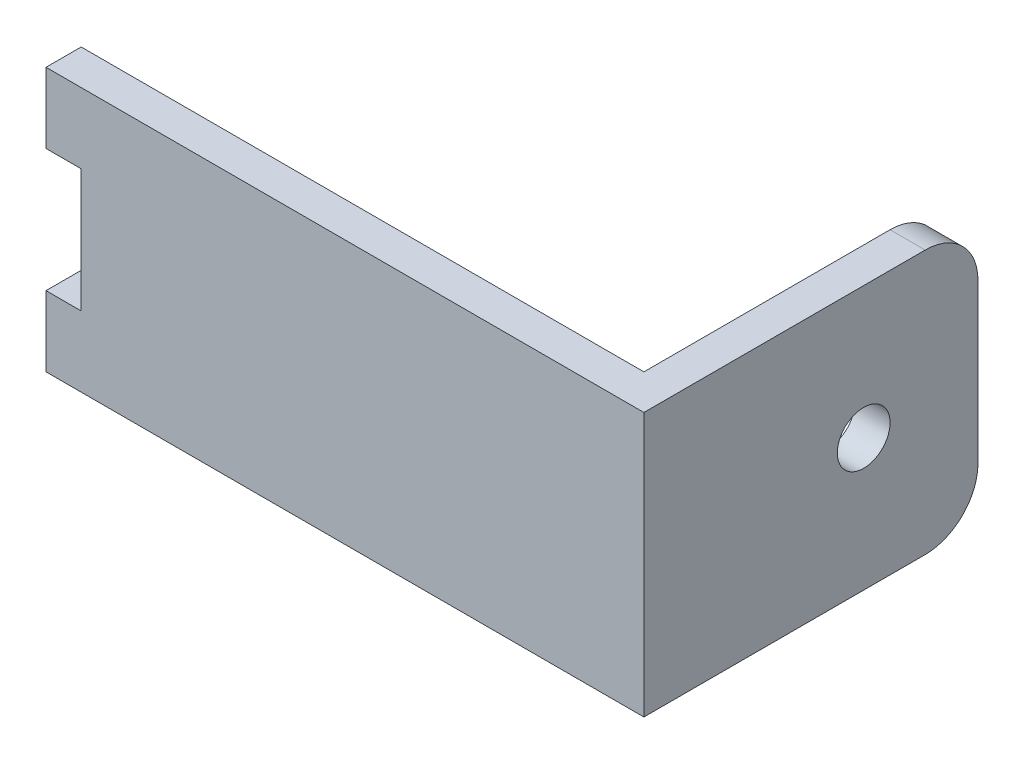
ISO-10303-21;
HEADER;
FILE_DESCRIPTION(('STEP AP214'),'2;1');
FILE_NAME('part.step','',(''),(''),'','','');
FILE_SCHEMA(('AUTOMOTIVE_DESIGN { 1 0 10303 214 1 1 1 1 }'));
ENDSEC;
DATA;
#1=APPLICATION_CONTEXT('core data for automotive mechanical design processes');
#2=APPLICATION_PROTOCOL_DEFINITION('international standard','automotive_design',2000,#1);
#3=PRODUCT_CONTEXT('',#1,'mechanical');
#4=PRODUCT('Part','Part','',(#3));
#5=PRODUCT_RELATED_PRODUCT_CATEGORY('part','',(#4));
#6=PRODUCT_DEFINITION_FORMATION('','',#4);
#7=PRODUCT_DEFINITION_CONTEXT('part definition',#1,'design');
#8=PRODUCT_DEFINITION('design','',#6,#7);
#9=PRODUCT_DEFINITION_SHAPE('','',#8);
#10=(LENGTH_UNIT() NAMED_UNIT(*) SI_UNIT(.MILLI.,.METRE.));
#11=(NAMED_UNIT(*) PLANE_ANGLE_UNIT() SI_UNIT($,.RADIAN.));
#12=(NAMED_UNIT(*) SI_UNIT($,.STERADIAN.) SOLID_ANGLE_UNIT());
#13=UNCERTAINTY_MEASURE_WITH_UNIT(LENGTH_MEASURE(1.E-05),#10,'distance_accuracy_value','');
#14=(GEOMETRIC_REPRESENTATION_CONTEXT(3) GLOBAL_UNCERTAINTY_ASSIGNED_CONTEXT((#13)) GLOBAL_UNIT_ASSIGNED_CONTEXT((#10,
#11,#12)) REPRESENTATION_CONTEXT('',''));
#15=CARTESIAN_POINT('',(0.,0.,0.));
#16=DIRECTION('',(0.,0.,1.));
#17=DIRECTION('',(1.,0.,0.));
#18=AXIS2_PLACEMENT_3D('',#15,#16,#17);
#19=CARTESIAN_POINT('',(0.,0.,2.));
#20=DIRECTION('',(1.,0.,0.));
#21=DIRECTION('',(0.,0.,-1.));
#22=AXIS2_PLACEMENT_3D('',#19,#20,#21);
#23=PLANE('',#22);
#24=DIRECTION('',(0.,0.,-1.));
#25=VECTOR('',#24,1.);
#26=CARTESIAN_POINT('',(0.,4.,2.));
#27=LINE('',#26,#25);
#28=CARTESIAN_POINT('',(0.,4.,2.));
#29=VERTEX_POINT('',#28);
#30=CARTESIAN_POINT('',(0.,4.,0.));
#31=VERTEX_POINT('',#30);
#32=EDGE_CURVE('E49',#29,#31,#27,.T.);
#33=ORIENTED_EDGE('',*,*,#32,.F.);
#34=DIRECTION('',(0.,-1.,0.));
#35=VECTOR('',#34,1.);
#36=CARTESIAN_POINT('',(0.,0.,2.));
#37=LINE('',#36,#35);
#38=CARTESIAN_POINT('',(0.,11.,2.));
#39=VERTEX_POINT('',#38);
#40=EDGE_CURVE('E143',#39,#29,#37,.T.);
#41=ORIENTED_EDGE('',*,*,#40,.F.);
#42=DIRECTION('',(0.,0.,1.));
#43=VECTOR('',#42,1.);
#44=CARTESIAN_POINT('',(0.,11.,0.));
#45=LINE('',#44,#43);
#46=CARTESIAN_POINT('',(0.,11.,0.));
#47=VERTEX_POINT('',#46);
#48=EDGE_CURVE('E144',#47,#39,#45,.T.);
#49=ORIENTED_EDGE('',*,*,#48,.F.);
#50=DIRECTION('',(0.,-1.,0.));
#51=VECTOR('',#50,1.);
#52=CARTESIAN_POINT('',(0.,0.,0.));
#53=LINE('',#52,#51);
#54=EDGE_CURVE('E54',#47,#31,#53,.T.);
#55=ORIENTED_EDGE('',*,*,#54,.T.);
#56=EDGE_LOOP('',(#33,#41,#49,#55));
#57=FACE_BOUND('',#56,.T.);
#58=ADVANCED_FACE('F34',(#57),#23,.F.);
#59=CARTESIAN_POINT('',(0.,0.,2.));
#60=DIRECTION('',(0.,1.,0.));
#61=DIRECTION('',(0.,0.,1.));
#62=AXIS2_PLACEMENT_3D('',#59,#60,#61);
#63=PLANE('',#62);
#64=DIRECTION('',(0.,0.,-1.));
#65=VECTOR('',#64,1.);
#66=CARTESIAN_POINT('',(30.,0.,2.));
#67=LINE('',#66,#65);
#68=CARTESIAN_POINT('',(30.,0.,0.));
#69=VERTEX_POINT('',#68);
#70=CARTESIAN_POINT('',(30.,0.,-14.));
#71=VERTEX_POINT('',#70);
#72=EDGE_CURVE('E171',#69,#71,#67,.T.);
#73=ORIENTED_EDGE('',*,*,#72,.T.);
#74=DIRECTION('',(-1.,0.,0.));
#75=VECTOR('',#74,1.);
#76=CARTESIAN_POINT('',(0.,0.,-14.));
#77=LINE('',#76,#75);
#78=CARTESIAN_POINT('',(32.,0.,-14.));
#79=VERTEX_POINT('',#78);
#80=EDGE_CURVE('E214',#71,#79,#77,.F.);
#81=ORIENTED_EDGE('',*,*,#80,.T.);
#82=DIRECTION('',(0.,0.,-1.));
#83=VECTOR('',#82,1.);
#84=CARTESIAN_POINT('',(32.,0.,2.));
#85=LINE('',#84,#83);
#86=CARTESIAN_POINT('',(32.,0.,2.));
#87=VERTEX_POINT('',#86);
#88=EDGE_CURVE('E177',#87,#79,#85,.T.);
#89=ORIENTED_EDGE('',*,*,#88,.F.);
#90=DIRECTION('',(1.,0.,0.));
#91=VECTOR('',#90,1.);
#92=CARTESIAN_POINT('',(0.,0.,2.));
#93=LINE('',#92,#91);
#94=CARTESIAN_POINT('',(-2.,0.,2.));
#95=VERTEX_POINT('',#94);
#96=EDGE_CURVE('E193',#95,#87,#93,.T.);
#97=ORIENTED_EDGE('',*,*,#96,.F.);
#98=DIRECTION('',(0.,0.,1.));
#99=VECTOR('',#98,1.);
#100=CARTESIAN_POINT('',(-2.,0.,2.));
#101=LINE('',#100,#99);
#102=CARTESIAN_POINT('',(-2.,0.,0.));
#103=VERTEX_POINT('',#102);
#104=EDGE_CURVE('E138',#103,#95,#101,.T.);
#105=ORIENTED_EDGE('',*,*,#104,.F.);
#106=DIRECTION('',(1.,0.,0.));
#107=VECTOR('',#106,1.);
#108=CARTESIAN_POINT('',(0.,0.,0.));
#109=LINE('',#108,#107);
#110=EDGE_CURVE('E200',#103,#69,#109,.T.);
#111=ORIENTED_EDGE('',*,*,#110,.T.);
#112=EDGE_LOOP('',(#73,#81,#89,#97,#105,#111));
#113=FACE_BOUND('',#112,.T.);
#114=ADVANCED_FACE('F235',(#113),#63,.F.);
#115=CARTESIAN_POINT('',(0.,15.,2.));
#116=DIRECTION('',(0.,-1.,0.));
#117=DIRECTION('',(0.,0.,-1.));
#118=AXIS2_PLACEMENT_3D('',#115,#116,#117);
#119=PLANE('',#118);
#120=DIRECTION('',(0.,0.,1.));
#121=VECTOR('',#120,1.);
#122=CARTESIAN_POINT('',(32.,15.,2.));
#123=LINE('',#122,#121);
#124=CARTESIAN_POINT('',(32.,15.,-14.));
#125=VERTEX_POINT('',#124);
#126=CARTESIAN_POINT('',(32.,15.,2.));
#127=VERTEX_POINT('',#126);
#128=EDGE_CURVE('E184',#125,#127,#123,.T.);
#129=ORIENTED_EDGE('',*,*,#128,.F.);
#130=DIRECTION('',(-1.,0.,0.));
#131=VECTOR('',#130,1.);
#132=CARTESIAN_POINT('',(0.,15.,-14.));
#133=LINE('',#132,#131);
#134=CARTESIAN_POINT('',(30.,15.,-14.));
#135=VERTEX_POINT('',#134);
#136=EDGE_CURVE('E11',#125,#135,#133,.T.);
#137=ORIENTED_EDGE('',*,*,#136,.T.);
#138=DIRECTION('',(0.,0.,1.));
#139=VECTOR('',#138,1.);
#140=CARTESIAN_POINT('',(30.,15.,2.));
#141=LINE('',#140,#139);
#142=CARTESIAN_POINT('',(30.,15.,0.));
#143=VERTEX_POINT('',#142);
#144=EDGE_CURVE('E178',#135,#143,#141,.T.);
#145=ORIENTED_EDGE('',*,*,#144,.T.);
#146=DIRECTION('',(-1.,0.,0.));
#147=VECTOR('',#146,1.);
#148=CARTESIAN_POINT('',(0.,15.,0.));
#149=LINE('',#148,#147);
#150=CARTESIAN_POINT('',(-2.,15.,0.));
#151=VERTEX_POINT('',#150);
#152=EDGE_CURVE('E194',#143,#151,#149,.T.);
#153=ORIENTED_EDGE('',*,*,#152,.T.);
#154=DIRECTION('',(0.,0.,-1.));
#155=VECTOR('',#154,1.);
#156=CARTESIAN_POINT('',(-2.,15.,0.));
#157=LINE('',#156,#155);
#158=CARTESIAN_POINT('',(-2.,15.,2.));
#159=VERTEX_POINT('',#158);
#160=EDGE_CURVE('E159',#159,#151,#157,.T.);
#161=ORIENTED_EDGE('',*,*,#160,.F.);
#162=DIRECTION('',(-1.,0.,0.));
#163=VECTOR('',#162,1.);
#164=CARTESIAN_POINT('',(0.,15.,2.));
#165=LINE('',#164,#163);
#166=EDGE_CURVE('E196',#127,#159,#165,.T.);
#167=ORIENTED_EDGE('',*,*,#166,.F.);
#168=EDGE_LOOP('',(#129,#137,#145,#153,#161,#167));
#169=FACE_BOUND('',#168,.T.);
#170=ADVANCED_FACE('F244',(#169),#119,.F.);
#171=CARTESIAN_POINT('',(0.,0.,2.));
#172=DIRECTION('',(0.,0.,-1.));
#173=DIRECTION('',(-1.,0.,0.));
#174=AXIS2_PLACEMENT_3D('',#171,#172,#173);
#175=PLANE('',#174);
#176=ORIENTED_EDGE('',*,*,#166,.T.);
#177=DIRECTION('',(0.,1.,0.));
#178=VECTOR('',#177,1.);
#179=CARTESIAN_POINT('',(-2.,15.,2.));
#180=LINE('',#179,#178);
#181=CARTESIAN_POINT('',(-2.,11.,2.));
#182=VERTEX_POINT('',#181);
#183=EDGE_CURVE('E156',#182,#159,#180,.T.);
#184=ORIENTED_EDGE('',*,*,#183,.F.);
#185=DIRECTION('',(1.,0.,0.));
#186=VECTOR('',#185,1.);
#187=CARTESIAN_POINT('',(-2.,11.,2.));
#188=LINE('',#187,#186);
#189=EDGE_CURVE('E161',#182,#39,#188,.T.);
#190=ORIENTED_EDGE('',*,*,#189,.T.);
#191=ORIENTED_EDGE('',*,*,#40,.T.);
#192=DIRECTION('',(1.,0.,0.));
#193=VECTOR('',#192,1.);
#194=CARTESIAN_POINT('',(-2.,4.,2.));
#195=LINE('',#194,#193);
#196=CARTESIAN_POINT('',(-2.,4.,2.));
#197=VERTEX_POINT('',#196);
#198=EDGE_CURVE('E125',#197,#29,#195,.T.);
#199=ORIENTED_EDGE('',*,*,#198,.F.);
#200=DIRECTION('',(0.,1.,0.));
#201=VECTOR('',#200,1.);
#202=CARTESIAN_POINT('',(-2.,0.,2.));
#203=LINE('',#202,#201);
#204=EDGE_CURVE('E132',#95,#197,#203,.T.);
#205=ORIENTED_EDGE('',*,*,#204,.F.);
#206=ORIENTED_EDGE('',*,*,#96,.T.);
#207=DIRECTION('',(0.,-1.,0.));
#208=VECTOR('',#207,1.);
#209=CARTESIAN_POINT('',(32.,0.,2.));
#210=LINE('',#209,#208);
#211=EDGE_CURVE('E174',#127,#87,#210,.T.);
#212=ORIENTED_EDGE('',*,*,#211,.F.);
#213=EDGE_LOOP('',(#176,#184,#190,#191,#199,#205,#206,#212));
#214=FACE_BOUND('',#213,.T.);
#215=ADVANCED_FACE('F141',(#214),#175,.F.);
#216=CARTESIAN_POINT('',(0.,0.,0.));
#217=DIRECTION('',(0.,0.,-1.));
#218=DIRECTION('',(-1.,0.,0.));
#219=AXIS2_PLACEMENT_3D('',#216,#217,#218);
#220=PLANE('',#219);
#221=ORIENTED_EDGE('',*,*,#54,.F.);
#222=DIRECTION('',(1.,0.,0.));
#223=VECTOR('',#222,1.);
#224=CARTESIAN_POINT('',(-2.,11.,0.));
#225=LINE('',#224,#223);
#226=CARTESIAN_POINT('',(-2.,11.,0.));
#227=VERTEX_POINT('',#226);
#228=EDGE_CURVE('E164',#227,#47,#225,.T.);
#229=ORIENTED_EDGE('',*,*,#228,.F.);
#230=DIRECTION('',(0.,-1.,0.));
#231=VECTOR('',#230,1.);
#232=CARTESIAN_POINT('',(-2.,15.,0.));
#233=LINE('',#232,#231);
#234=EDGE_CURVE('E147',#151,#227,#233,.T.);
#235=ORIENTED_EDGE('',*,*,#234,.F.);
#236=ORIENTED_EDGE('',*,*,#152,.F.);
#237=DIRECTION('',(0.,1.,0.));
#238=VECTOR('',#237,1.);
#239=CARTESIAN_POINT('',(30.,0.,0.));
#240=LINE('',#239,#238);
#241=EDGE_CURVE('E202',#69,#143,#240,.T.);
#242=ORIENTED_EDGE('',*,*,#241,.F.);
#243=ORIENTED_EDGE('',*,*,#110,.F.);
#244=DIRECTION('',(0.,-1.,0.));
#245=VECTOR('',#244,1.);
#246=CARTESIAN_POINT('',(-2.,0.,0.));
#247=LINE('',#246,#245);
#248=CARTESIAN_POINT('',(-2.,4.,0.));
#249=VERTEX_POINT('',#248);
#250=EDGE_CURVE('E131',#249,#103,#247,.T.);
#251=ORIENTED_EDGE('',*,*,#250,.F.);
#252=DIRECTION('',(1.,0.,0.));
#253=VECTOR('',#252,1.);
#254=CARTESIAN_POINT('',(-2.,4.,0.));
#255=LINE('',#254,#253);
#256=EDGE_CURVE('E127',#249,#31,#255,.T.);
#257=ORIENTED_EDGE('',*,*,#256,.T.);
#258=EDGE_LOOP('',(#221,#229,#235,#236,#242,#243,#251,#257));
#259=FACE_BOUND('',#258,.T.);
#260=ADVANCED_FACE('F239',(#259),#220,.T.);
#261=CARTESIAN_POINT('',(32.,0.,-17.));
#262=DIRECTION('',(0.,0.,1.));
#263=DIRECTION('',(1.,0.,0.));
#264=AXIS2_PLACEMENT_3D('',#261,#262,#263);
#265=PLANE('',#264);
#266=DIRECTION('',(0.,1.,0.));
#267=VECTOR('',#266,1.);
#268=CARTESIAN_POINT('',(32.,0.,-17.));
#269=LINE('',#268,#267);
#270=CARTESIAN_POINT('',(32.,3.,-17.));
#271=VERTEX_POINT('',#270);
#272=CARTESIAN_POINT('',(32.,12.,-17.));
#273=VERTEX_POINT('',#272);
#274=EDGE_CURVE('E181',#271,#273,#269,.T.);
#275=ORIENTED_EDGE('',*,*,#274,.F.);
#276=DIRECTION('',(-1.,0.,0.));
#277=VECTOR('',#276,1.);
#278=CARTESIAN_POINT('',(32.,3.,-17.));
#279=LINE('',#278,#277);
#280=CARTESIAN_POINT('',(30.,3.,-17.));
#281=VERTEX_POINT('',#280);
#282=EDGE_CURVE('E207',#271,#281,#279,.T.);
#283=ORIENTED_EDGE('',*,*,#282,.T.);
#284=DIRECTION('',(0.,1.,0.));
#285=VECTOR('',#284,1.);
#286=CARTESIAN_POINT('',(30.,0.,-17.));
#287=LINE('',#286,#285);
#288=CARTESIAN_POINT('',(30.,12.,-17.));
#289=VERTEX_POINT('',#288);
#290=EDGE_CURVE('E188',#281,#289,#287,.T.);
#291=ORIENTED_EDGE('',*,*,#290,.T.);
#292=DIRECTION('',(-1.,0.,0.));
#293=VECTOR('',#292,1.);
#294=CARTESIAN_POINT('',(32.,12.,-17.));
#295=LINE('',#294,#293);
#296=EDGE_CURVE('E198',#289,#273,#295,.F.);
#297=ORIENTED_EDGE('',*,*,#296,.T.);
#298=EDGE_LOOP('',(#275,#283,#291,#297));
#299=FACE_BOUND('',#298,.T.);
#300=ADVANCED_FACE('F227',(#299),#265,.F.);
#301=CARTESIAN_POINT('',(32.,0.,0.));
#302=DIRECTION('',(-1.,0.,0.));
#303=DIRECTION('',(0.,0.,1.));
#304=AXIS2_PLACEMENT_3D('',#301,#302,#303);
#305=PLANE('',#304);
#306=CARTESIAN_POINT('',(32.,7.5,-10.5));
#307=DIRECTION('',(1.,0.,0.));
#308=DIRECTION('',(0.,0.,-1.));
#309=AXIS2_PLACEMENT_3D('',#306,#307,#308);
#310=CIRCLE('',#309,1.5);
#311=CARTESIAN_POINT('',(32.,7.5,-12.));
#312=VERTEX_POINT('',#311);
#313=EDGE_CURVE('E167',#312,#312,#310,.T.);
#314=ORIENTED_EDGE('',*,*,#313,.F.);
#315=EDGE_LOOP('',(#314));
#316=FACE_BOUND('',#315,.T.);
#317=ORIENTED_EDGE('',*,*,#88,.T.);
#318=CARTESIAN_POINT('',(32.,3.,-14.));
#319=DIRECTION('',(-1.,0.,0.));
#320=DIRECTION('',(0.,0.,1.));
#321=AXIS2_PLACEMENT_3D('',#318,#319,#320);
#322=CIRCLE('',#321,3.);
#323=EDGE_CURVE('E42',#79,#271,#322,.F.);
#324=ORIENTED_EDGE('',*,*,#323,.T.);
#325=ORIENTED_EDGE('',*,*,#274,.T.);
#326=CARTESIAN_POINT('',(32.,12.,-14.));
#327=DIRECTION('',(-1.,0.,0.));
#328=DIRECTION('',(0.,0.,1.));
#329=AXIS2_PLACEMENT_3D('',#326,#327,#328);
#330=CIRCLE('',#329,3.);
#331=EDGE_CURVE('E216',#273,#125,#330,.F.);
#332=ORIENTED_EDGE('',*,*,#331,.T.);
#333=ORIENTED_EDGE('',*,*,#128,.T.);
#334=ORIENTED_EDGE('',*,*,#211,.T.);
#335=EDGE_LOOP('',(#317,#324,#325,#332,#333,#334));
#336=FACE_BOUND('',#335,.T.);
#337=ADVANCED_FACE('F220',(#316,#336),#305,.F.);
#338=CARTESIAN_POINT('',(30.,0.,0.));
#339=DIRECTION('',(-1.,0.,0.));
#340=DIRECTION('',(0.,0.,1.));
#341=AXIS2_PLACEMENT_3D('',#338,#339,#340);
#342=PLANE('',#341);
#343=CARTESIAN_POINT('',(30.,7.5,-10.5));
#344=DIRECTION('',(1.,0.,0.));
#345=DIRECTION('',(0.,0.,-1.));
#346=AXIS2_PLACEMENT_3D('',#343,#344,#345);
#347=CIRCLE('',#346,1.5);
#348=CARTESIAN_POINT('',(30.,7.5,-12.));
#349=VERTEX_POINT('',#348);
#350=EDGE_CURVE('E168',#349,#349,#347,.T.);
#351=ORIENTED_EDGE('',*,*,#350,.T.);
#352=EDGE_LOOP('',(#351));
#353=FACE_BOUND('',#352,.T.);
#354=ORIENTED_EDGE('',*,*,#290,.F.);
#355=CARTESIAN_POINT('',(30.,3.,-14.));
#356=DIRECTION('',(-1.,0.,0.));
#357=DIRECTION('',(0.,0.,1.));
#358=AXIS2_PLACEMENT_3D('',#355,#356,#357);
#359=CIRCLE('',#358,3.);
#360=EDGE_CURVE('E212',#281,#71,#359,.T.);
#361=ORIENTED_EDGE('',*,*,#360,.T.);
#362=ORIENTED_EDGE('',*,*,#72,.F.);
#363=ORIENTED_EDGE('',*,*,#241,.T.);
#364=ORIENTED_EDGE('',*,*,#144,.F.);
#365=CARTESIAN_POINT('',(30.,12.,-14.));
#366=DIRECTION('',(-1.,0.,0.));
#367=DIRECTION('',(0.,0.,1.));
#368=AXIS2_PLACEMENT_3D('',#365,#366,#367);
#369=CIRCLE('',#368,3.);
#370=EDGE_CURVE('E210',#135,#289,#369,.T.);
#371=ORIENTED_EDGE('',*,*,#370,.T.);
#372=EDGE_LOOP('',(#354,#361,#362,#363,#364,#371));
#373=FACE_BOUND('',#372,.T.);
#374=ADVANCED_FACE('F233',(#353,#373),#342,.T.);
#375=CARTESIAN_POINT('',(30.,7.5,-10.5));
#376=DIRECTION('',(1.,0.,0.));
#377=DIRECTION('',(0.,0.,-1.));
#378=AXIS2_PLACEMENT_3D('',#375,#376,#377);
#379=CYLINDRICAL_SURFACE('',#378,1.5);
#380=ORIENTED_EDGE('',*,*,#350,.F.);
#381=EDGE_LOOP('',(#380));
#382=FACE_BOUND('',#381,.T.);
#383=ORIENTED_EDGE('',*,*,#313,.T.);
#384=EDGE_LOOP('',(#383));
#385=FACE_BOUND('',#384,.T.);
#386=ADVANCED_FACE('F267',(#382,#385),#379,.F.);
#387=CARTESIAN_POINT('',(32.,3.,-14.));
#388=DIRECTION('',(-1.,0.,0.));
#389=DIRECTION('',(0.,0.,1.));
#390=AXIS2_PLACEMENT_3D('',#387,#388,#389);
#391=CYLINDRICAL_SURFACE('',#390,3.);
#392=ORIENTED_EDGE('',*,*,#323,.F.);
#393=ORIENTED_EDGE('',*,*,#80,.F.);
#394=ORIENTED_EDGE('',*,*,#360,.F.);
#395=ORIENTED_EDGE('',*,*,#282,.F.);
#396=EDGE_LOOP('',(#392,#393,#394,#395));
#397=FACE_BOUND('',#396,.T.);
#398=ADVANCED_FACE('F230',(#397),#391,.T.);
#399=CARTESIAN_POINT('',(0.,12.,-14.));
#400=DIRECTION('',(-1.,0.,0.));
#401=DIRECTION('',(0.,0.,1.));
#402=AXIS2_PLACEMENT_3D('',#399,#400,#401);
#403=CYLINDRICAL_SURFACE('',#402,3.);
#404=ORIENTED_EDGE('',*,*,#331,.F.);
#405=ORIENTED_EDGE('',*,*,#296,.F.);
#406=ORIENTED_EDGE('',*,*,#370,.F.);
#407=ORIENTED_EDGE('',*,*,#136,.F.);
#408=EDGE_LOOP('',(#404,#405,#406,#407));
#409=FACE_BOUND('',#408,.T.);
#410=ADVANCED_FACE('F36',(#409),#403,.T.);
#411=CARTESIAN_POINT('',(-2.,11.,0.));
#412=DIRECTION('',(0.,1.,0.));
#413=DIRECTION('',(0.,0.,1.));
#414=AXIS2_PLACEMENT_3D('',#411,#412,#413);
#415=PLANE('',#414);
#416=ORIENTED_EDGE('',*,*,#48,.T.);
#417=ORIENTED_EDGE('',*,*,#189,.F.);
#418=DIRECTION('',(0.,0.,1.));
#419=VECTOR('',#418,1.);
#420=CARTESIAN_POINT('',(-2.,11.,0.));
#421=LINE('',#420,#419);
#422=EDGE_CURVE('E154',#227,#182,#421,.T.);
#423=ORIENTED_EDGE('',*,*,#422,.F.);
#424=ORIENTED_EDGE('',*,*,#228,.T.);
#425=EDGE_LOOP('',(#416,#417,#423,#424));
#426=FACE_BOUND('',#425,.T.);
#427=ADVANCED_FACE('F256',(#426),#415,.F.);
#428=CARTESIAN_POINT('',(-2.,0.,0.));
#429=DIRECTION('',(-1.,0.,0.));
#430=DIRECTION('',(0.,0.,1.));
#431=AXIS2_PLACEMENT_3D('',#428,#429,#430);
#432=PLANE('',#431);
#433=ORIENTED_EDGE('',*,*,#234,.T.);
#434=ORIENTED_EDGE('',*,*,#422,.T.);
#435=ORIENTED_EDGE('',*,*,#183,.T.);
#436=ORIENTED_EDGE('',*,*,#160,.T.);
#437=EDGE_LOOP('',(#433,#434,#435,#436));
#438=FACE_BOUND('',#437,.T.);
#439=ADVANCED_FACE('F252',(#438),#432,.T.);
#440=CARTESIAN_POINT('',(-2.,4.,2.));
#441=DIRECTION('',(0.,-1.,0.));
#442=DIRECTION('',(0.,0.,-1.));
#443=AXIS2_PLACEMENT_3D('',#440,#441,#442);
#444=PLANE('',#443);
#445=ORIENTED_EDGE('',*,*,#32,.T.);
#446=ORIENTED_EDGE('',*,*,#256,.F.);
#447=DIRECTION('',(0.,0.,-1.));
#448=VECTOR('',#447,1.);
#449=CARTESIAN_POINT('',(-2.,4.,2.));
#450=LINE('',#449,#448);
#451=EDGE_CURVE('E121',#197,#249,#450,.T.);
#452=ORIENTED_EDGE('',*,*,#451,.F.);
#453=ORIENTED_EDGE('',*,*,#198,.T.);
#454=EDGE_LOOP('',(#445,#446,#452,#453));
#455=FACE_BOUND('',#454,.T.);
#456=ADVANCED_FACE('F123',(#455),#444,.F.);
#457=CARTESIAN_POINT('',(-2.,0.,0.));
#458=DIRECTION('',(-1.,0.,0.));
#459=DIRECTION('',(0.,0.,1.));
#460=AXIS2_PLACEMENT_3D('',#457,#458,#459);
#461=PLANE('',#460);
#462=ORIENTED_EDGE('',*,*,#204,.T.);
#463=ORIENTED_EDGE('',*,*,#451,.T.);
#464=ORIENTED_EDGE('',*,*,#250,.T.);
#465=ORIENTED_EDGE('',*,*,#104,.T.);
#466=EDGE_LOOP('',(#462,#463,#464,#465));
#467=FACE_BOUND('',#466,.T.);
#468=ADVANCED_FACE('F136',(#467),#461,.T.);
#469=CLOSED_SHELL('',(#58,#114,#170,#215,#260,#300,#337,#374,#386,#398,#410,#427,#439,#456,#468));
#470=MANIFOLD_SOLID_BREP('B2',#469);
#471=ADVANCED_BREP_SHAPE_REPRESENTATION('',(#18,#470),#14);
#472=SHAPE_DEFINITION_REPRESENTATION(#9,#471);
ENDSEC;
END-ISO-10303-21;
